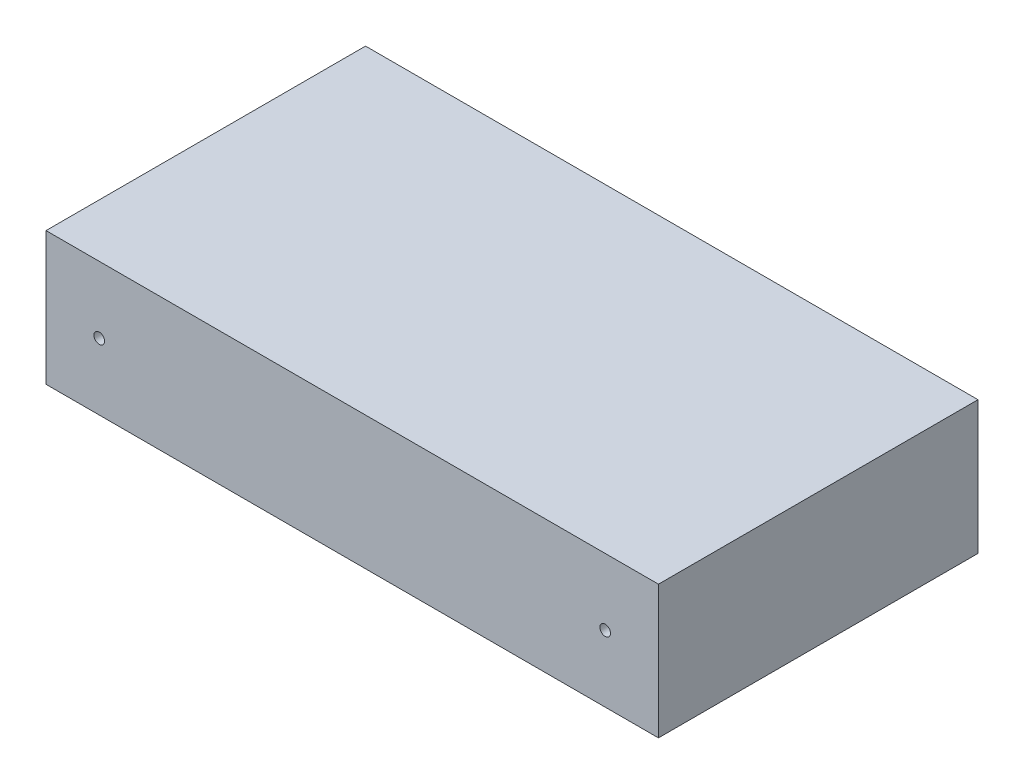
ISO-10303-21;
HEADER;
FILE_DESCRIPTION(('STEP AP214'),'2;1');
FILE_NAME('part.step','',(''),(''),'','','');
FILE_SCHEMA(('AUTOMOTIVE_DESIGN { 1 0 10303 214 1 1 1 1 }'));
ENDSEC;
DATA;
#1=APPLICATION_CONTEXT('core data for automotive mechanical design processes');
#2=APPLICATION_PROTOCOL_DEFINITION('international standard','automotive_design',2000,#1);
#3=PRODUCT_CONTEXT('',#1,'mechanical');
#4=PRODUCT('Part','Part','',(#3));
#5=PRODUCT_RELATED_PRODUCT_CATEGORY('part','',(#4));
#6=PRODUCT_DEFINITION_FORMATION('','',#4);
#7=PRODUCT_DEFINITION_CONTEXT('part definition',#1,'design');
#8=PRODUCT_DEFINITION('design','',#6,#7);
#9=PRODUCT_DEFINITION_SHAPE('','',#8);
#10=(LENGTH_UNIT() NAMED_UNIT(*) SI_UNIT(.MILLI.,.METRE.));
#11=(NAMED_UNIT(*) PLANE_ANGLE_UNIT() SI_UNIT($,.RADIAN.));
#12=(NAMED_UNIT(*) SI_UNIT($,.STERADIAN.) SOLID_ANGLE_UNIT());
#13=UNCERTAINTY_MEASURE_WITH_UNIT(LENGTH_MEASURE(1.E-05),#10,'distance_accuracy_value','');
#14=(GEOMETRIC_REPRESENTATION_CONTEXT(3) GLOBAL_UNCERTAINTY_ASSIGNED_CONTEXT((#13)) GLOBAL_UNIT_ASSIGNED_CONTEXT((#10,
#11,#12)) REPRESENTATION_CONTEXT('',''));
#15=CARTESIAN_POINT('',(0.,0.,0.));
#16=DIRECTION('',(0.,0.,1.));
#17=DIRECTION('',(1.,0.,0.));
#18=AXIS2_PLACEMENT_3D('',#15,#16,#17);
#19=CARTESIAN_POINT('',(0.,50.,0.));
#20=DIRECTION('',(1.,0.,0.));
#21=DIRECTION('',(0.,0.,-1.));
#22=AXIS2_PLACEMENT_3D('',#19,#20,#21);
#23=PLANE('',#22);
#24=DIRECTION('',(0.,0.,1.));
#25=VECTOR('',#24,1.);
#26=CARTESIAN_POINT('',(0.,0.,0.));
#27=LINE('',#26,#25);
#28=CARTESIAN_POINT('',(0.,0.,-120.));
#29=VERTEX_POINT('',#28);
#30=CARTESIAN_POINT('',(0.,0.,0.));
#31=VERTEX_POINT('',#30);
#32=EDGE_CURVE('E96',#29,#31,#27,.T.);
#33=ORIENTED_EDGE('',*,*,#32,.T.);
#34=DIRECTION('',(0.,-1.,0.));
#35=VECTOR('',#34,1.);
#36=CARTESIAN_POINT('',(0.,50.,0.));
#37=LINE('',#36,#35);
#38=CARTESIAN_POINT('',(0.,50.,0.));
#39=VERTEX_POINT('',#38);
#40=EDGE_CURVE('E11',#39,#31,#37,.T.);
#41=ORIENTED_EDGE('',*,*,#40,.F.);
#42=DIRECTION('',(0.,0.,1.));
#43=VECTOR('',#42,1.);
#44=CARTESIAN_POINT('',(0.,50.,0.));
#45=LINE('',#44,#43);
#46=CARTESIAN_POINT('',(0.,50.,-120.));
#47=VERTEX_POINT('',#46);
#48=EDGE_CURVE('E84',#47,#39,#45,.T.);
#49=ORIENTED_EDGE('',*,*,#48,.F.);
#50=DIRECTION('',(0.,-1.,0.));
#51=VECTOR('',#50,1.);
#52=CARTESIAN_POINT('',(0.,50.,-120.));
#53=LINE('',#52,#51);
#54=EDGE_CURVE('E92',#47,#29,#53,.T.);
#55=ORIENTED_EDGE('',*,*,#54,.T.);
#56=EDGE_LOOP('',(#33,#41,#49,#55));
#57=FACE_BOUND('',#56,.T.);
#58=ADVANCED_FACE('F33',(#57),#23,.F.);
#59=CARTESIAN_POINT('',(0.,50.,0.));
#60=DIRECTION('',(0.,0.,-1.));
#61=DIRECTION('',(-1.,0.,0.));
#62=AXIS2_PLACEMENT_3D('',#59,#60,#61);
#63=PLANE('',#62);
#64=CARTESIAN_POINT('',(210.,25.,0.));
#65=DIRECTION('',(0.,0.,1.));
#66=DIRECTION('',(1.,0.,0.));
#67=AXIS2_PLACEMENT_3D('',#64,#65,#66);
#68=CIRCLE('',#67,2.);
#69=CARTESIAN_POINT('',(212.,25.,0.));
#70=VERTEX_POINT('',#69);
#71=EDGE_CURVE('E116',#70,#70,#68,.T.);
#72=ORIENTED_EDGE('',*,*,#71,.F.);
#73=EDGE_LOOP('',(#72));
#74=FACE_BOUND('',#73,.T.);
#75=CARTESIAN_POINT('',(20.,25.,0.));
#76=DIRECTION('',(0.,0.,1.));
#77=DIRECTION('',(1.,0.,0.));
#78=AXIS2_PLACEMENT_3D('',#75,#76,#77);
#79=CIRCLE('',#78,2.);
#80=CARTESIAN_POINT('',(22.,25.,0.));
#81=VERTEX_POINT('',#80);
#82=EDGE_CURVE('E110',#81,#81,#79,.T.);
#83=ORIENTED_EDGE('',*,*,#82,.F.);
#84=EDGE_LOOP('',(#83));
#85=FACE_BOUND('',#84,.T.);
#86=DIRECTION('',(1.,0.,0.));
#87=VECTOR('',#86,1.);
#88=CARTESIAN_POINT('',(0.,0.,0.));
#89=LINE('',#88,#87);
#90=CARTESIAN_POINT('',(230.,0.,0.));
#91=VERTEX_POINT('',#90);
#92=EDGE_CURVE('E88',#31,#91,#89,.T.);
#93=ORIENTED_EDGE('',*,*,#92,.T.);
#94=DIRECTION('',(0.,-1.,0.));
#95=VECTOR('',#94,1.);
#96=CARTESIAN_POINT('',(230.,50.,0.));
#97=LINE('',#96,#95);
#98=CARTESIAN_POINT('',(230.,50.,0.));
#99=VERTEX_POINT('',#98);
#100=EDGE_CURVE('E41',#99,#91,#97,.T.);
#101=ORIENTED_EDGE('',*,*,#100,.F.);
#102=DIRECTION('',(1.,0.,0.));
#103=VECTOR('',#102,1.);
#104=CARTESIAN_POINT('',(0.,50.,0.));
#105=LINE('',#104,#103);
#106=EDGE_CURVE('E79',#39,#99,#105,.T.);
#107=ORIENTED_EDGE('',*,*,#106,.F.);
#108=ORIENTED_EDGE('',*,*,#40,.T.);
#109=EDGE_LOOP('',(#93,#101,#107,#108));
#110=FACE_BOUND('',#109,.T.);
#111=ADVANCED_FACE('F87',(#74,#85,#110),#63,.F.);
#112=CARTESIAN_POINT('',(230.,50.,0.));
#113=DIRECTION('',(-1.,0.,0.));
#114=DIRECTION('',(0.,0.,1.));
#115=AXIS2_PLACEMENT_3D('',#112,#113,#114);
#116=PLANE('',#115);
#117=DIRECTION('',(0.,0.,-1.));
#118=VECTOR('',#117,1.);
#119=CARTESIAN_POINT('',(230.,0.,0.));
#120=LINE('',#119,#118);
#121=CARTESIAN_POINT('',(230.,0.,-120.));
#122=VERTEX_POINT('',#121);
#123=EDGE_CURVE('E66',#91,#122,#120,.T.);
#124=ORIENTED_EDGE('',*,*,#123,.T.);
#125=DIRECTION('',(0.,-1.,0.));
#126=VECTOR('',#125,1.);
#127=CARTESIAN_POINT('',(230.,50.,-120.));
#128=LINE('',#127,#126);
#129=CARTESIAN_POINT('',(230.,50.,-120.));
#130=VERTEX_POINT('',#129);
#131=EDGE_CURVE('E89',#130,#122,#128,.T.);
#132=ORIENTED_EDGE('',*,*,#131,.F.);
#133=DIRECTION('',(0.,0.,-1.));
#134=VECTOR('',#133,1.);
#135=CARTESIAN_POINT('',(230.,50.,0.));
#136=LINE('',#135,#134);
#137=EDGE_CURVE('E82',#99,#130,#136,.T.);
#138=ORIENTED_EDGE('',*,*,#137,.F.);
#139=ORIENTED_EDGE('',*,*,#100,.T.);
#140=EDGE_LOOP('',(#124,#132,#138,#139));
#141=FACE_BOUND('',#140,.T.);
#142=ADVANCED_FACE('F90',(#141),#116,.F.);
#143=CARTESIAN_POINT('',(0.,50.,-120.));
#144=DIRECTION('',(0.,0.,1.));
#145=DIRECTION('',(1.,0.,0.));
#146=AXIS2_PLACEMENT_3D('',#143,#144,#145);
#147=PLANE('',#146);
#148=DIRECTION('',(-1.,0.,0.));
#149=VECTOR('',#148,1.);
#150=CARTESIAN_POINT('',(0.,0.,-120.));
#151=LINE('',#150,#149);
#152=EDGE_CURVE('E72',#122,#29,#151,.T.);
#153=ORIENTED_EDGE('',*,*,#152,.T.);
#154=ORIENTED_EDGE('',*,*,#54,.F.);
#155=DIRECTION('',(-1.,0.,0.));
#156=VECTOR('',#155,1.);
#157=CARTESIAN_POINT('',(0.,50.,-120.));
#158=LINE('',#157,#156);
#159=EDGE_CURVE('E49',#130,#47,#158,.T.);
#160=ORIENTED_EDGE('',*,*,#159,.F.);
#161=ORIENTED_EDGE('',*,*,#131,.T.);
#162=EDGE_LOOP('',(#153,#154,#160,#161));
#163=FACE_BOUND('',#162,.T.);
#164=ADVANCED_FACE('F104',(#163),#147,.F.);
#165=CARTESIAN_POINT('',(0.,50.,0.));
#166=DIRECTION('',(0.,-1.,0.));
#167=DIRECTION('',(0.,0.,-1.));
#168=AXIS2_PLACEMENT_3D('',#165,#166,#167);
#169=PLANE('',#168);
#170=ORIENTED_EDGE('',*,*,#48,.T.);
#171=ORIENTED_EDGE('',*,*,#106,.T.);
#172=ORIENTED_EDGE('',*,*,#137,.T.);
#173=ORIENTED_EDGE('',*,*,#159,.T.);
#174=EDGE_LOOP('',(#170,#171,#172,#173));
#175=FACE_BOUND('',#174,.T.);
#176=ADVANCED_FACE('F80',(#175),#169,.F.);
#177=CARTESIAN_POINT('',(0.,0.,0.));
#178=DIRECTION('',(0.,-1.,0.));
#179=DIRECTION('',(0.,0.,-1.));
#180=AXIS2_PLACEMENT_3D('',#177,#178,#179);
#181=PLANE('',#180);
#182=ORIENTED_EDGE('',*,*,#32,.F.);
#183=ORIENTED_EDGE('',*,*,#152,.F.);
#184=ORIENTED_EDGE('',*,*,#123,.F.);
#185=ORIENTED_EDGE('',*,*,#92,.F.);
#186=EDGE_LOOP('',(#182,#183,#184,#185));
#187=FACE_BOUND('',#186,.T.);
#188=ADVANCED_FACE('F107',(#187),#181,.T.);
#189=CARTESIAN_POINT('',(20.,25.,-10.));
#190=DIRECTION('',(0.,0.,1.));
#191=DIRECTION('',(1.,0.,0.));
#192=AXIS2_PLACEMENT_3D('',#189,#190,#191);
#193=CYLINDRICAL_SURFACE('',#192,2.);
#194=CARTESIAN_POINT('',(20.,25.,-10.));
#195=DIRECTION('',(0.,0.,1.));
#196=DIRECTION('',(1.,0.,0.));
#197=AXIS2_PLACEMENT_3D('',#194,#195,#196);
#198=CIRCLE('',#197,2.);
#199=CARTESIAN_POINT('',(22.,25.,-10.));
#200=VERTEX_POINT('',#199);
#201=EDGE_CURVE('E99',#200,#200,#198,.T.);
#202=ORIENTED_EDGE('',*,*,#201,.F.);
#203=EDGE_LOOP('',(#202));
#204=FACE_BOUND('',#203,.T.);
#205=ORIENTED_EDGE('',*,*,#82,.T.);
#206=EDGE_LOOP('',(#205));
#207=FACE_BOUND('',#206,.T.);
#208=ADVANCED_FACE('F135',(#204,#207),#193,.F.);
#209=CARTESIAN_POINT('',(20.,25.,-10.));
#210=DIRECTION('',(0.,0.,1.));
#211=DIRECTION('',(1.,0.,0.));
#212=AXIS2_PLACEMENT_3D('',#209,#210,#211);
#213=PLANE('',#212);
#214=ORIENTED_EDGE('',*,*,#201,.T.);
#215=EDGE_LOOP('',(#214));
#216=FACE_BOUND('',#215,.T.);
#217=ADVANCED_FACE('F127',(#216),#213,.T.);
#218=CARTESIAN_POINT('',(210.,25.,-10.));
#219=DIRECTION('',(0.,0.,1.));
#220=DIRECTION('',(1.,0.,0.));
#221=AXIS2_PLACEMENT_3D('',#218,#219,#220);
#222=CYLINDRICAL_SURFACE('',#221,2.);
#223=CARTESIAN_POINT('',(210.,25.,-10.));
#224=DIRECTION('',(0.,0.,1.));
#225=DIRECTION('',(1.,0.,0.));
#226=AXIS2_PLACEMENT_3D('',#223,#224,#225);
#227=CIRCLE('',#226,2.);
#228=CARTESIAN_POINT('',(212.,25.,-10.));
#229=VERTEX_POINT('',#228);
#230=EDGE_CURVE('E113',#229,#229,#227,.T.);
#231=ORIENTED_EDGE('',*,*,#230,.F.);
#232=EDGE_LOOP('',(#231));
#233=FACE_BOUND('',#232,.T.);
#234=ORIENTED_EDGE('',*,*,#71,.T.);
#235=EDGE_LOOP('',(#234));
#236=FACE_BOUND('',#235,.T.);
#237=ADVANCED_FACE('F124',(#233,#236),#222,.F.);
#238=CARTESIAN_POINT('',(210.,25.,-10.));
#239=DIRECTION('',(0.,0.,1.));
#240=DIRECTION('',(1.,0.,0.));
#241=AXIS2_PLACEMENT_3D('',#238,#239,#240);
#242=PLANE('',#241);
#243=ORIENTED_EDGE('',*,*,#230,.T.);
#244=EDGE_LOOP('',(#243));
#245=FACE_BOUND('',#244,.T.);
#246=ADVANCED_FACE('F122',(#245),#242,.T.);
#247=CLOSED_SHELL('',(#58,#111,#142,#164,#176,#188,#208,#217,#237,#246));
#248=MANIFOLD_SOLID_BREP('B2',#247);
#249=ADVANCED_BREP_SHAPE_REPRESENTATION('',(#18,#248),#14);
#250=SHAPE_DEFINITION_REPRESENTATION(#9,#249);
ENDSEC;
END-ISO-10303-21;
